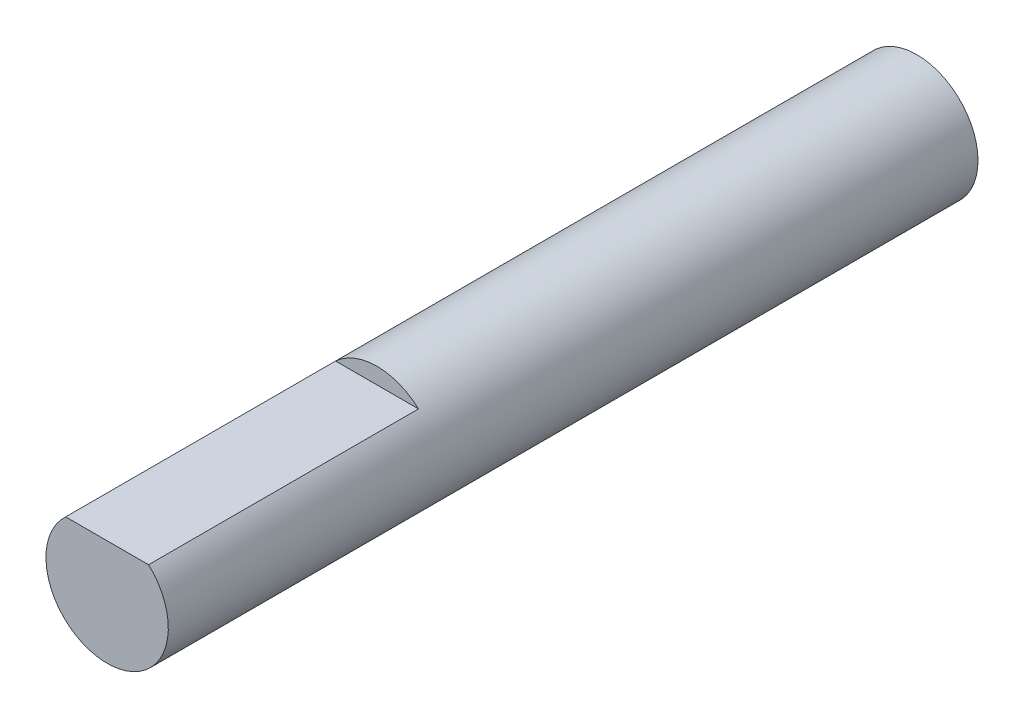
ISO-10303-21;
HEADER;
FILE_DESCRIPTION(('STEP AP214'),'2;1');
FILE_NAME('part.step','',(''),(''),'','','');
FILE_SCHEMA(('AUTOMOTIVE_DESIGN { 1 0 10303 214 1 1 1 1 }'));
ENDSEC;
DATA;
#1=APPLICATION_CONTEXT('core data for automotive mechanical design processes');
#2=APPLICATION_PROTOCOL_DEFINITION('international standard','automotive_design',2000,#1);
#3=PRODUCT_CONTEXT('',#1,'mechanical');
#4=PRODUCT('Part','Part','',(#3));
#5=PRODUCT_RELATED_PRODUCT_CATEGORY('part','',(#4));
#6=PRODUCT_DEFINITION_FORMATION('','',#4);
#7=PRODUCT_DEFINITION_CONTEXT('part definition',#1,'design');
#8=PRODUCT_DEFINITION('design','',#6,#7);
#9=PRODUCT_DEFINITION_SHAPE('','',#8);
#10=(LENGTH_UNIT() NAMED_UNIT(*) SI_UNIT(.MILLI.,.METRE.));
#11=(NAMED_UNIT(*) PLANE_ANGLE_UNIT() SI_UNIT($,.RADIAN.));
#12=(NAMED_UNIT(*) SI_UNIT($,.STERADIAN.) SOLID_ANGLE_UNIT());
#13=UNCERTAINTY_MEASURE_WITH_UNIT(LENGTH_MEASURE(1.E-05),#10,'distance_accuracy_value','');
#14=(GEOMETRIC_REPRESENTATION_CONTEXT(3) GLOBAL_UNCERTAINTY_ASSIGNED_CONTEXT((#13)) GLOBAL_UNIT_ASSIGNED_CONTEXT((#10,
#11,#12)) REPRESENTATION_CONTEXT('',''));
#15=CARTESIAN_POINT('',(0.,0.,0.));
#16=DIRECTION('',(0.,0.,1.));
#17=DIRECTION('',(1.,0.,0.));
#18=AXIS2_PLACEMENT_3D('',#15,#16,#17);
#19=CARTESIAN_POINT('',(0.,12.7,76.2));
#20=DIRECTION('',(0.,-1.,0.));
#21=DIRECTION('',(0.,0.,-1.));
#22=AXIS2_PLACEMENT_3D('',#19,#20,#21);
#23=PLANE('',#22);
#24=DIRECTION('',(-1.,0.,0.));
#25=VECTOR('',#24,1.);
#26=CARTESIAN_POINT('',(0.,12.7,0.));
#27=LINE('',#26,#25);
#28=CARTESIAN_POINT('',(11.7060661197518,12.7,0.));
#29=VERTEX_POINT('',#28);
#30=CARTESIAN_POINT('',(-11.7060661197518,12.7,0.));
#31=VERTEX_POINT('',#30);
#32=EDGE_CURVE('E62',#29,#31,#27,.T.);
#33=ORIENTED_EDGE('',*,*,#32,.T.);
#34=DIRECTION('',(0.,0.,-1.));
#35=VECTOR('',#34,1.);
#36=CARTESIAN_POINT('',(-11.7060661197518,12.7,76.2));
#37=LINE('',#36,#35);
#38=CARTESIAN_POINT('',(-11.7060661197518,12.7,76.2));
#39=VERTEX_POINT('',#38);
#40=EDGE_CURVE('E11',#39,#31,#37,.T.);
#41=ORIENTED_EDGE('',*,*,#40,.F.);
#42=DIRECTION('',(-1.,0.,0.));
#43=VECTOR('',#42,1.);
#44=CARTESIAN_POINT('',(0.,12.7,76.2));
#45=LINE('',#44,#43);
#46=CARTESIAN_POINT('',(11.7060661197518,12.7,76.2));
#47=VERTEX_POINT('',#46);
#48=EDGE_CURVE('E75',#47,#39,#45,.T.);
#49=ORIENTED_EDGE('',*,*,#48,.F.);
#50=DIRECTION('',(0.,0.,-1.));
#51=VECTOR('',#50,1.);
#52=CARTESIAN_POINT('',(11.7060661197518,12.7,76.2));
#53=LINE('',#52,#51);
#54=EDGE_CURVE('E47',#47,#29,#53,.T.);
#55=ORIENTED_EDGE('',*,*,#54,.T.);
#56=EDGE_LOOP('',(#33,#41,#49,#55));
#57=FACE_BOUND('',#56,.T.);
#58=ADVANCED_FACE('F39',(#57),#23,.F.);
#59=CARTESIAN_POINT('',(0.,0.,76.2));
#60=DIRECTION('',(0.,0.,-1.));
#61=DIRECTION('',(-1.,0.,0.));
#62=AXIS2_PLACEMENT_3D('',#59,#60,#61);
#63=CYLINDRICAL_SURFACE('',#62,17.272);
#64=ORIENTED_EDGE('',*,*,#40,.T.);
#65=CARTESIAN_POINT('',(0.,0.,0.));
#66=DIRECTION('',(0.,0.,1.));
#67=DIRECTION('',(1.,0.,0.));
#68=AXIS2_PLACEMENT_3D('',#65,#66,#67);
#69=CIRCLE('',#68,17.272);
#70=EDGE_CURVE('E64',#29,#31,#69,.T.);
#71=ORIENTED_EDGE('',*,*,#70,.F.);
#72=ORIENTED_EDGE('',*,*,#54,.F.);
#73=CARTESIAN_POINT('',(0.,0.,76.2));
#74=DIRECTION('',(0.,0.,1.));
#75=DIRECTION('',(1.,0.,0.));
#76=AXIS2_PLACEMENT_3D('',#73,#74,#75);
#77=CIRCLE('',#76,17.272);
#78=EDGE_CURVE('E53',#39,#47,#77,.T.);
#79=ORIENTED_EDGE('',*,*,#78,.F.);
#80=EDGE_LOOP('',(#64,#71,#72,#79));
#81=FACE_BOUND('',#80,.T.);
#82=CARTESIAN_POINT('',(0.,0.,-152.4));
#83=DIRECTION('',(0.,0.,1.));
#84=DIRECTION('',(1.,0.,0.));
#85=AXIS2_PLACEMENT_3D('',#82,#83,#84);
#86=CIRCLE('',#85,17.272);
#87=CARTESIAN_POINT('',(17.272,0.,-152.4));
#88=VERTEX_POINT('',#87);
#89=EDGE_CURVE('E68',#88,#88,#86,.T.);
#90=ORIENTED_EDGE('',*,*,#89,.T.);
#91=EDGE_LOOP('',(#90));
#92=FACE_BOUND('',#91,.T.);
#93=ADVANCED_FACE('F71',(#81,#92),#63,.T.);
#94=CARTESIAN_POINT('',(0.,0.,76.2));
#95=DIRECTION('',(0.,0.,1.));
#96=DIRECTION('',(1.,0.,0.));
#97=AXIS2_PLACEMENT_3D('',#94,#95,#96);
#98=PLANE('',#97);
#99=ORIENTED_EDGE('',*,*,#48,.T.);
#100=ORIENTED_EDGE('',*,*,#78,.T.);
#101=EDGE_LOOP('',(#99,#100));
#102=FACE_BOUND('',#101,.T.);
#103=ADVANCED_FACE('F89',(#102),#98,.T.);
#104=CARTESIAN_POINT('',(0.,0.,0.));
#105=DIRECTION('',(0.,0.,1.));
#106=DIRECTION('',(1.,0.,0.));
#107=AXIS2_PLACEMENT_3D('',#104,#105,#106);
#108=PLANE('',#107);
#109=ORIENTED_EDGE('',*,*,#32,.F.);
#110=ORIENTED_EDGE('',*,*,#70,.T.);
#111=EDGE_LOOP('',(#109,#110));
#112=FACE_BOUND('',#111,.T.);
#113=ADVANCED_FACE('F65',(#112),#108,.T.);
#114=CARTESIAN_POINT('',(0.,0.,-152.4));
#115=DIRECTION('',(0.,0.,1.));
#116=DIRECTION('',(1.,0.,0.));
#117=AXIS2_PLACEMENT_3D('',#114,#115,#116);
#118=PLANE('',#117);
#119=ORIENTED_EDGE('',*,*,#89,.F.);
#120=EDGE_LOOP('',(#119));
#121=FACE_BOUND('',#120,.T.);
#122=ADVANCED_FACE('F83',(#121),#118,.F.);
#123=CLOSED_SHELL('',(#58,#93,#103,#113,#122));
#124=MANIFOLD_SOLID_BREP('B2',#123);
#125=ADVANCED_BREP_SHAPE_REPRESENTATION('',(#18,#124),#14);
#126=SHAPE_DEFINITION_REPRESENTATION(#9,#125);
ENDSEC;
END-ISO-10303-21;
